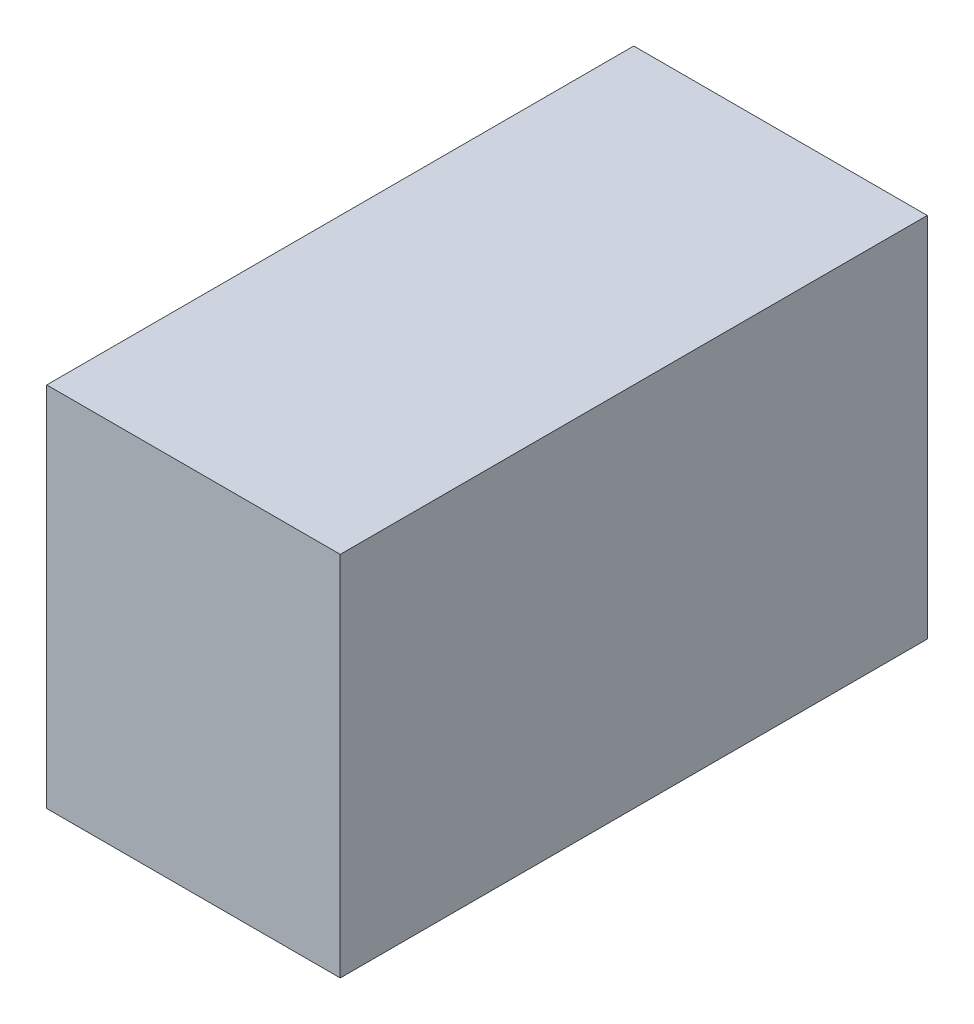
ISO-10303-21;
HEADER;
FILE_DESCRIPTION(('STEP AP214'),'2;1');
FILE_NAME('part.step','',(''),(''),'','','');
FILE_SCHEMA(('AUTOMOTIVE_DESIGN { 1 0 10303 214 1 1 1 1 }'));
ENDSEC;
DATA;
#1=APPLICATION_CONTEXT('core data for automotive mechanical design processes');
#2=APPLICATION_PROTOCOL_DEFINITION('international standard','automotive_design',2000,#1);
#3=PRODUCT_CONTEXT('',#1,'mechanical');
#4=PRODUCT('Part','Part','',(#3));
#5=PRODUCT_RELATED_PRODUCT_CATEGORY('part','',(#4));
#6=PRODUCT_DEFINITION_FORMATION('','',#4);
#7=PRODUCT_DEFINITION_CONTEXT('part definition',#1,'design');
#8=PRODUCT_DEFINITION('design','',#6,#7);
#9=PRODUCT_DEFINITION_SHAPE('','',#8);
#10=(LENGTH_UNIT() NAMED_UNIT(*) SI_UNIT(.MILLI.,.METRE.));
#11=(NAMED_UNIT(*) PLANE_ANGLE_UNIT() SI_UNIT($,.RADIAN.));
#12=(NAMED_UNIT(*) SI_UNIT($,.STERADIAN.) SOLID_ANGLE_UNIT());
#13=UNCERTAINTY_MEASURE_WITH_UNIT(LENGTH_MEASURE(1.E-05),#10,'distance_accuracy_value','');
#14=(GEOMETRIC_REPRESENTATION_CONTEXT(3) GLOBAL_UNCERTAINTY_ASSIGNED_CONTEXT((#13)) GLOBAL_UNIT_ASSIGNED_CONTEXT((#10,
#11,#12)) REPRESENTATION_CONTEXT('',''));
#15=CARTESIAN_POINT('',(0.,0.,0.));
#16=DIRECTION('',(0.,0.,1.));
#17=DIRECTION('',(1.,0.,0.));
#18=AXIS2_PLACEMENT_3D('',#15,#16,#17);
#19=CARTESIAN_POINT('',(-101.6,-127.,406.4));
#20=DIRECTION('',(1.,0.,0.));
#21=DIRECTION('',(0.,0.,-1.));
#22=AXIS2_PLACEMENT_3D('',#19,#20,#21);
#23=PLANE('',#22);
#24=DIRECTION('',(0.,-1.,0.));
#25=VECTOR('',#24,1.);
#26=CARTESIAN_POINT('',(-101.6,-127.,0.));
#27=LINE('',#26,#25);
#28=CARTESIAN_POINT('',(-101.6,127.,0.));
#29=VERTEX_POINT('',#28);
#30=CARTESIAN_POINT('',(-101.6,-127.,0.));
#31=VERTEX_POINT('',#30);
#32=EDGE_CURVE('E117',#29,#31,#27,.T.);
#33=ORIENTED_EDGE('',*,*,#32,.T.);
#34=DIRECTION('',(0.,0.,-1.));
#35=VECTOR('',#34,1.);
#36=CARTESIAN_POINT('',(-101.6,-127.,406.4));
#37=LINE('',#36,#35);
#38=CARTESIAN_POINT('',(-101.6,-127.,406.4));
#39=VERTEX_POINT('',#38);
#40=EDGE_CURVE('E11',#39,#31,#37,.T.);
#41=ORIENTED_EDGE('',*,*,#40,.F.);
#42=DIRECTION('',(0.,-1.,0.));
#43=VECTOR('',#42,1.);
#44=CARTESIAN_POINT('',(-101.6,-127.,406.4));
#45=LINE('',#44,#43);
#46=CARTESIAN_POINT('',(-101.6,127.,406.4));
#47=VERTEX_POINT('',#46);
#48=EDGE_CURVE('E101',#47,#39,#45,.T.);
#49=ORIENTED_EDGE('',*,*,#48,.F.);
#50=DIRECTION('',(0.,0.,-1.));
#51=VECTOR('',#50,1.);
#52=CARTESIAN_POINT('',(-101.6,127.,406.4));
#53=LINE('',#52,#51);
#54=EDGE_CURVE('E113',#47,#29,#53,.T.);
#55=ORIENTED_EDGE('',*,*,#54,.T.);
#56=EDGE_LOOP('',(#33,#41,#49,#55));
#57=FACE_BOUND('',#56,.T.);
#58=ADVANCED_FACE('F49',(#57),#23,.F.);
#59=CARTESIAN_POINT('',(101.6,-127.,406.4));
#60=DIRECTION('',(0.,1.,0.));
#61=DIRECTION('',(-1.,0.,0.));
#62=AXIS2_PLACEMENT_3D('',#59,#60,#61);
#63=PLANE('',#62);
#64=DIRECTION('',(1.,0.,0.));
#65=VECTOR('',#64,1.);
#66=CARTESIAN_POINT('',(101.6,-127.,0.));
#67=LINE('',#66,#65);
#68=CARTESIAN_POINT('',(101.6,-127.,0.));
#69=VERTEX_POINT('',#68);
#70=EDGE_CURVE('E106',#31,#69,#67,.T.);
#71=ORIENTED_EDGE('',*,*,#70,.T.);
#72=DIRECTION('',(0.,0.,-1.));
#73=VECTOR('',#72,1.);
#74=CARTESIAN_POINT('',(101.6,-127.,406.4));
#75=LINE('',#74,#73);
#76=CARTESIAN_POINT('',(101.6,-127.,406.4));
#77=VERTEX_POINT('',#76);
#78=EDGE_CURVE('E58',#77,#69,#75,.T.);
#79=ORIENTED_EDGE('',*,*,#78,.F.);
#80=DIRECTION('',(1.,0.,0.));
#81=VECTOR('',#80,1.);
#82=CARTESIAN_POINT('',(101.6,-127.,406.4));
#83=LINE('',#82,#81);
#84=EDGE_CURVE('E96',#39,#77,#83,.T.);
#85=ORIENTED_EDGE('',*,*,#84,.F.);
#86=ORIENTED_EDGE('',*,*,#40,.T.);
#87=EDGE_LOOP('',(#71,#79,#85,#86));
#88=FACE_BOUND('',#87,.T.);
#89=ADVANCED_FACE('F105',(#88),#63,.F.);
#90=CARTESIAN_POINT('',(101.6,-127.,406.4));
#91=DIRECTION('',(-1.,0.,0.));
#92=DIRECTION('',(0.,-1.,0.));
#93=AXIS2_PLACEMENT_3D('',#90,#91,#92);
#94=PLANE('',#93);
#95=DIRECTION('',(0.,1.,0.));
#96=VECTOR('',#95,1.);
#97=CARTESIAN_POINT('',(101.6,-127.,0.));
#98=LINE('',#97,#96);
#99=CARTESIAN_POINT('',(101.6,127.,0.));
#100=VERTEX_POINT('',#99);
#101=EDGE_CURVE('E83',#69,#100,#98,.T.);
#102=ORIENTED_EDGE('',*,*,#101,.T.);
#103=DIRECTION('',(0.,0.,-1.));
#104=VECTOR('',#103,1.);
#105=CARTESIAN_POINT('',(101.6,127.,406.4));
#106=LINE('',#105,#104);
#107=CARTESIAN_POINT('',(101.6,127.,406.4));
#108=VERTEX_POINT('',#107);
#109=EDGE_CURVE('E108',#108,#100,#106,.T.);
#110=ORIENTED_EDGE('',*,*,#109,.F.);
#111=DIRECTION('',(0.,1.,0.));
#112=VECTOR('',#111,1.);
#113=CARTESIAN_POINT('',(101.6,-127.,406.4));
#114=LINE('',#113,#112);
#115=EDGE_CURVE('E99',#77,#108,#114,.T.);
#116=ORIENTED_EDGE('',*,*,#115,.F.);
#117=ORIENTED_EDGE('',*,*,#78,.T.);
#118=EDGE_LOOP('',(#102,#110,#116,#117));
#119=FACE_BOUND('',#118,.T.);
#120=ADVANCED_FACE('F109',(#119),#94,.F.);
#121=CARTESIAN_POINT('',(101.6,127.,406.4));
#122=DIRECTION('',(0.,-1.,0.));
#123=DIRECTION('',(1.,0.,0.));
#124=AXIS2_PLACEMENT_3D('',#121,#122,#123);
#125=PLANE('',#124);
#126=DIRECTION('',(-1.,0.,0.));
#127=VECTOR('',#126,1.);
#128=CARTESIAN_POINT('',(101.6,127.,0.));
#129=LINE('',#128,#127);
#130=EDGE_CURVE('E89',#100,#29,#129,.T.);
#131=ORIENTED_EDGE('',*,*,#130,.T.);
#132=ORIENTED_EDGE('',*,*,#54,.F.);
#133=DIRECTION('',(-1.,0.,0.));
#134=VECTOR('',#133,1.);
#135=CARTESIAN_POINT('',(101.6,127.,406.4));
#136=LINE('',#135,#134);
#137=EDGE_CURVE('E66',#108,#47,#136,.T.);
#138=ORIENTED_EDGE('',*,*,#137,.F.);
#139=ORIENTED_EDGE('',*,*,#109,.T.);
#140=EDGE_LOOP('',(#131,#132,#138,#139));
#141=FACE_BOUND('',#140,.T.);
#142=ADVANCED_FACE('F130',(#141),#125,.F.);
#143=CARTESIAN_POINT('',(0.,0.,406.4));
#144=DIRECTION('',(0.,0.,1.));
#145=DIRECTION('',(1.,0.,0.));
#146=AXIS2_PLACEMENT_3D('',#143,#144,#145);
#147=PLANE('',#146);
#148=ORIENTED_EDGE('',*,*,#48,.T.);
#149=ORIENTED_EDGE('',*,*,#84,.T.);
#150=ORIENTED_EDGE('',*,*,#115,.T.);
#151=ORIENTED_EDGE('',*,*,#137,.T.);
#152=EDGE_LOOP('',(#148,#149,#150,#151));
#153=FACE_BOUND('',#152,.T.);
#154=ADVANCED_FACE('F97',(#153),#147,.T.);
#155=CARTESIAN_POINT('',(0.,0.,0.));
#156=DIRECTION('',(0.,0.,1.));
#157=DIRECTION('',(1.,0.,0.));
#158=AXIS2_PLACEMENT_3D('',#155,#156,#157);
#159=PLANE('',#158);
#160=ORIENTED_EDGE('',*,*,#32,.F.);
#161=ORIENTED_EDGE('',*,*,#130,.F.);
#162=ORIENTED_EDGE('',*,*,#101,.F.);
#163=ORIENTED_EDGE('',*,*,#70,.F.);
#164=EDGE_LOOP('',(#160,#161,#162,#163));
#165=FACE_BOUND('',#164,.T.);
#166=ADVANCED_FACE('F133',(#165),#159,.F.);
#167=CLOSED_SHELL('',(#58,#89,#120,#142,#154,#166));
#168=MANIFOLD_SOLID_BREP('B2',#167);
#169=ADVANCED_BREP_SHAPE_REPRESENTATION('',(#18,#168),#14);
#170=SHAPE_DEFINITION_REPRESENTATION(#9,#169);
ENDSEC;
END-ISO-10303-21;
